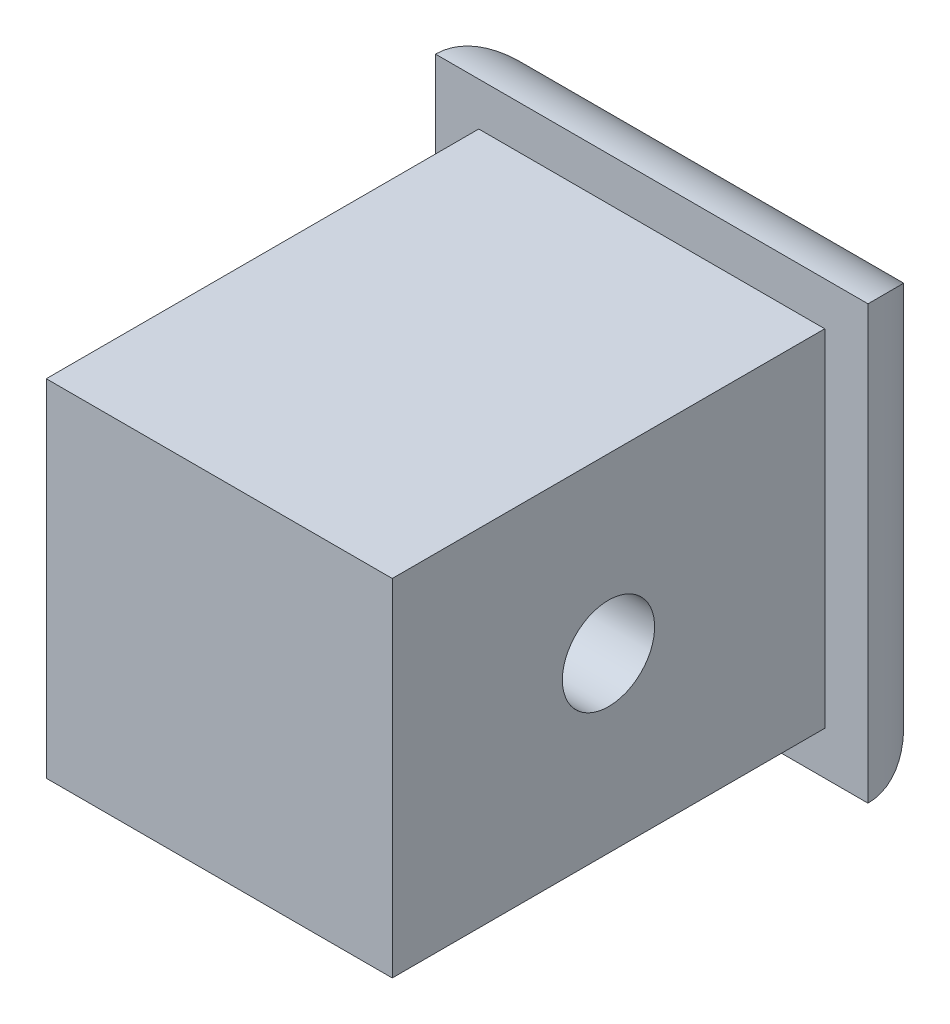
ISO-10303-21;
HEADER;
FILE_DESCRIPTION(('STEP AP214'),'2;1');
FILE_NAME('part.step','',(''),(''),'','','');
FILE_SCHEMA(('AUTOMOTIVE_DESIGN { 1 0 10303 214 1 1 1 1 }'));
ENDSEC;
DATA;
#1=APPLICATION_CONTEXT('core data for automotive mechanical design processes');
#2=APPLICATION_PROTOCOL_DEFINITION('international standard','automotive_design',2000,#1);
#3=PRODUCT_CONTEXT('',#1,'mechanical');
#4=PRODUCT('Part','Part','',(#3));
#5=PRODUCT_RELATED_PRODUCT_CATEGORY('part','',(#4));
#6=PRODUCT_DEFINITION_FORMATION('','',#4);
#7=PRODUCT_DEFINITION_CONTEXT('part definition',#1,'design');
#8=PRODUCT_DEFINITION('design','',#6,#7);
#9=PRODUCT_DEFINITION_SHAPE('','',#8);
#10=(LENGTH_UNIT() NAMED_UNIT(*) SI_UNIT(.MILLI.,.METRE.));
#11=(NAMED_UNIT(*) PLANE_ANGLE_UNIT() SI_UNIT($,.RADIAN.));
#12=(NAMED_UNIT(*) SI_UNIT($,.STERADIAN.) SOLID_ANGLE_UNIT());
#13=UNCERTAINTY_MEASURE_WITH_UNIT(LENGTH_MEASURE(1.E-05),#10,'distance_accuracy_value','');
#14=(GEOMETRIC_REPRESENTATION_CONTEXT(3) GLOBAL_UNCERTAINTY_ASSIGNED_CONTEXT((#13)) GLOBAL_UNIT_ASSIGNED_CONTEXT((#10,
#11,#12)) REPRESENTATION_CONTEXT('',''));
#15=CARTESIAN_POINT('',(0.,0.,0.));
#16=DIRECTION('',(0.,0.,1.));
#17=DIRECTION('',(1.,0.,0.));
#18=AXIS2_PLACEMENT_3D('',#15,#16,#17);
#19=CARTESIAN_POINT('',(0.,0.,3.));
#20=DIRECTION('',(0.,0.,1.));
#21=DIRECTION('',(1.,0.,0.));
#22=AXIS2_PLACEMENT_3D('',#19,#20,#21);
#23=PLANE('',#22);
#24=DIRECTION('',(0.,1.,0.));
#25=VECTOR('',#24,1.);
#26=CARTESIAN_POINT('',(6.,6.,3.));
#27=LINE('',#26,#25);
#28=CARTESIAN_POINT('',(6.,-6.,3.));
#29=VERTEX_POINT('',#28);
#30=CARTESIAN_POINT('',(6.,6.,3.));
#31=VERTEX_POINT('',#30);
#32=EDGE_CURVE('E137',#29,#31,#27,.T.);
#33=ORIENTED_EDGE('',*,*,#32,.F.);
#34=DIRECTION('',(1.,0.,0.));
#35=VECTOR('',#34,1.);
#36=CARTESIAN_POINT('',(-6.,-6.,3.));
#37=LINE('',#36,#35);
#38=CARTESIAN_POINT('',(-6.,-6.,3.));
#39=VERTEX_POINT('',#38);
#40=EDGE_CURVE('E134',#39,#29,#37,.T.);
#41=ORIENTED_EDGE('',*,*,#40,.F.);
#42=DIRECTION('',(0.,-1.,0.));
#43=VECTOR('',#42,1.);
#44=CARTESIAN_POINT('',(-6.,6.,3.));
#45=LINE('',#44,#43);
#46=CARTESIAN_POINT('',(-6.,6.,3.));
#47=VERTEX_POINT('',#46);
#48=EDGE_CURVE('E202',#47,#39,#45,.T.);
#49=ORIENTED_EDGE('',*,*,#48,.F.);
#50=DIRECTION('',(-1.,0.,0.));
#51=VECTOR('',#50,1.);
#52=CARTESIAN_POINT('',(-6.,6.,3.));
#53=LINE('',#52,#51);
#54=EDGE_CURVE('E199',#31,#47,#53,.T.);
#55=ORIENTED_EDGE('',*,*,#54,.F.);
#56=EDGE_LOOP('',(#33,#41,#49,#55));
#57=FACE_BOUND('',#56,.T.);
#58=DIRECTION('',(0.,1.,0.));
#59=VECTOR('',#58,1.);
#60=CARTESIAN_POINT('',(7.5,7.5,3.));
#61=LINE('',#60,#59);
#62=CARTESIAN_POINT('',(7.5,-7.5,3.));
#63=VERTEX_POINT('',#62);
#64=CARTESIAN_POINT('',(7.5,7.5,3.));
#65=VERTEX_POINT('',#64);
#66=EDGE_CURVE('E139',#63,#65,#61,.T.);
#67=ORIENTED_EDGE('',*,*,#66,.T.);
#68=DIRECTION('',(-1.,0.,0.));
#69=VECTOR('',#68,1.);
#70=CARTESIAN_POINT('',(-7.5,7.5,3.));
#71=LINE('',#70,#69);
#72=CARTESIAN_POINT('',(-7.5,7.5,3.));
#73=VERTEX_POINT('',#72);
#74=EDGE_CURVE('E143',#65,#73,#71,.T.);
#75=ORIENTED_EDGE('',*,*,#74,.T.);
#76=DIRECTION('',(0.,-1.,0.));
#77=VECTOR('',#76,1.);
#78=CARTESIAN_POINT('',(-7.5,7.5,3.));
#79=LINE('',#78,#77);
#80=CARTESIAN_POINT('',(-7.5,-7.5,3.));
#81=VERTEX_POINT('',#80);
#82=EDGE_CURVE('E152',#73,#81,#79,.T.);
#83=ORIENTED_EDGE('',*,*,#82,.T.);
#84=DIRECTION('',(1.,0.,0.));
#85=VECTOR('',#84,1.);
#86=CARTESIAN_POINT('',(-7.5,-7.5,3.));
#87=LINE('',#86,#85);
#88=EDGE_CURVE('E155',#81,#63,#87,.T.);
#89=ORIENTED_EDGE('',*,*,#88,.T.);
#90=EDGE_LOOP('',(#67,#75,#83,#89));
#91=FACE_BOUND('',#90,.T.);
#92=ADVANCED_FACE('F45',(#57,#91),#23,.T.);
#93=CARTESIAN_POINT('',(0.,0.,0.));
#94=DIRECTION('',(0.,0.,1.));
#95=DIRECTION('',(1.,0.,0.));
#96=AXIS2_PLACEMENT_3D('',#93,#94,#95);
#97=PLANE('',#96);
#98=DIRECTION('',(0.,-1.,0.));
#99=VECTOR('',#98,1.);
#100=CARTESIAN_POINT('',(-4.5,0.,0.));
#101=LINE('',#100,#99);
#102=CARTESIAN_POINT('',(-4.5,-4.5,0.));
#103=VERTEX_POINT('',#102);
#104=CARTESIAN_POINT('',(-4.5,4.5,0.));
#105=VERTEX_POINT('',#104);
#106=EDGE_CURVE('E55',#103,#105,#101,.F.);
#107=ORIENTED_EDGE('',*,*,#106,.T.);
#108=DIRECTION('',(-1.,0.,0.));
#109=VECTOR('',#108,1.);
#110=CARTESIAN_POINT('',(0.,4.5,0.));
#111=LINE('',#110,#109);
#112=CARTESIAN_POINT('',(4.5,4.5,0.));
#113=VERTEX_POINT('',#112);
#114=EDGE_CURVE('E11',#105,#113,#111,.F.);
#115=ORIENTED_EDGE('',*,*,#114,.T.);
#116=DIRECTION('',(0.,1.,0.));
#117=VECTOR('',#116,1.);
#118=CARTESIAN_POINT('',(4.5,0.,0.));
#119=LINE('',#118,#117);
#120=CARTESIAN_POINT('',(4.5,-4.5,0.));
#121=VERTEX_POINT('',#120);
#122=EDGE_CURVE('E158',#113,#121,#119,.F.);
#123=ORIENTED_EDGE('',*,*,#122,.T.);
#124=DIRECTION('',(1.,0.,0.));
#125=VECTOR('',#124,1.);
#126=CARTESIAN_POINT('',(0.,-4.5,0.));
#127=LINE('',#126,#125);
#128=EDGE_CURVE('E66',#121,#103,#127,.F.);
#129=ORIENTED_EDGE('',*,*,#128,.T.);
#130=EDGE_LOOP('',(#107,#115,#123,#129));
#131=FACE_BOUND('',#130,.T.);
#132=ADVANCED_FACE('F220',(#131),#97,.F.);
#133=CARTESIAN_POINT('',(6.,6.,18.));
#134=DIRECTION('',(-1.,0.,0.));
#135=DIRECTION('',(0.,0.,1.));
#136=AXIS2_PLACEMENT_3D('',#133,#134,#135);
#137=PLANE('',#136);
#138=CARTESIAN_POINT('',(6.,0.,10.5));
#139=DIRECTION('',(-1.,0.,0.));
#140=DIRECTION('',(0.,0.,1.));
#141=AXIS2_PLACEMENT_3D('',#138,#139,#140);
#142=CIRCLE('',#141,1.6);
#143=CARTESIAN_POINT('',(6.,0.,12.1));
#144=VERTEX_POINT('',#143);
#145=EDGE_CURVE('E184',#144,#144,#142,.T.);
#146=ORIENTED_EDGE('',*,*,#145,.T.);
#147=EDGE_LOOP('',(#146));
#148=FACE_BOUND('',#147,.T.);
#149=ORIENTED_EDGE('',*,*,#32,.T.);
#150=DIRECTION('',(0.,0.,-1.));
#151=VECTOR('',#150,1.);
#152=CARTESIAN_POINT('',(6.,6.,18.));
#153=LINE('',#152,#151);
#154=CARTESIAN_POINT('',(6.,6.,18.));
#155=VERTEX_POINT('',#154);
#156=EDGE_CURVE('E116',#155,#31,#153,.T.);
#157=ORIENTED_EDGE('',*,*,#156,.F.);
#158=DIRECTION('',(0.,1.,0.));
#159=VECTOR('',#158,1.);
#160=CARTESIAN_POINT('',(6.,6.,18.));
#161=LINE('',#160,#159);
#162=CARTESIAN_POINT('',(6.,-6.,18.));
#163=VERTEX_POINT('',#162);
#164=EDGE_CURVE('E124',#163,#155,#161,.T.);
#165=ORIENTED_EDGE('',*,*,#164,.F.);
#166=DIRECTION('',(0.,0.,-1.));
#167=VECTOR('',#166,1.);
#168=CARTESIAN_POINT('',(6.,-6.,18.));
#169=LINE('',#168,#167);
#170=EDGE_CURVE('E196',#163,#29,#169,.T.);
#171=ORIENTED_EDGE('',*,*,#170,.T.);
#172=EDGE_LOOP('',(#149,#157,#165,#171));
#173=FACE_BOUND('',#172,.T.);
#174=ADVANCED_FACE('F136',(#148,#173),#137,.F.);
#175=CARTESIAN_POINT('',(-6.,6.,18.));
#176=DIRECTION('',(0.,-1.,0.));
#177=DIRECTION('',(0.,0.,-1.));
#178=AXIS2_PLACEMENT_3D('',#175,#176,#177);
#179=PLANE('',#178);
#180=ORIENTED_EDGE('',*,*,#54,.T.);
#181=DIRECTION('',(0.,0.,-1.));
#182=VECTOR('',#181,1.);
#183=CARTESIAN_POINT('',(-6.,6.,18.));
#184=LINE('',#183,#182);
#185=CARTESIAN_POINT('',(-6.,6.,18.));
#186=VERTEX_POINT('',#185);
#187=EDGE_CURVE('E119',#186,#47,#184,.T.);
#188=ORIENTED_EDGE('',*,*,#187,.F.);
#189=DIRECTION('',(-1.,0.,0.));
#190=VECTOR('',#189,1.);
#191=CARTESIAN_POINT('',(-6.,6.,18.));
#192=LINE('',#191,#190);
#193=EDGE_CURVE('E111',#155,#186,#192,.T.);
#194=ORIENTED_EDGE('',*,*,#193,.F.);
#195=ORIENTED_EDGE('',*,*,#156,.T.);
#196=EDGE_LOOP('',(#180,#188,#194,#195));
#197=FACE_BOUND('',#196,.T.);
#198=ADVANCED_FACE('F114',(#197),#179,.F.);
#199=CARTESIAN_POINT('',(-6.,6.,18.));
#200=DIRECTION('',(1.,0.,0.));
#201=DIRECTION('',(0.,0.,-1.));
#202=AXIS2_PLACEMENT_3D('',#199,#200,#201);
#203=PLANE('',#202);
#204=CARTESIAN_POINT('',(-6.,0.,10.5));
#205=DIRECTION('',(-1.,0.,0.));
#206=DIRECTION('',(0.,0.,1.));
#207=AXIS2_PLACEMENT_3D('',#204,#205,#206);
#208=CIRCLE('',#207,1.6);
#209=CARTESIAN_POINT('',(-6.,0.,12.1));
#210=VERTEX_POINT('',#209);
#211=EDGE_CURVE('E177',#210,#210,#208,.T.);
#212=ORIENTED_EDGE('',*,*,#211,.F.);
#213=EDGE_LOOP('',(#212));
#214=FACE_BOUND('',#213,.T.);
#215=ORIENTED_EDGE('',*,*,#48,.T.);
#216=DIRECTION('',(0.,0.,-1.));
#217=VECTOR('',#216,1.);
#218=CARTESIAN_POINT('',(-6.,-6.,18.));
#219=LINE('',#218,#217);
#220=CARTESIAN_POINT('',(-6.,-6.,18.));
#221=VERTEX_POINT('',#220);
#222=EDGE_CURVE('E145',#221,#39,#219,.T.);
#223=ORIENTED_EDGE('',*,*,#222,.F.);
#224=DIRECTION('',(0.,-1.,0.));
#225=VECTOR('',#224,1.);
#226=CARTESIAN_POINT('',(-6.,6.,18.));
#227=LINE('',#226,#225);
#228=EDGE_CURVE('E123',#186,#221,#227,.T.);
#229=ORIENTED_EDGE('',*,*,#228,.F.);
#230=ORIENTED_EDGE('',*,*,#187,.T.);
#231=EDGE_LOOP('',(#215,#223,#229,#230));
#232=FACE_BOUND('',#231,.T.);
#233=ADVANCED_FACE('F216',(#214,#232),#203,.F.);
#234=CARTESIAN_POINT('',(-6.,-6.,18.));
#235=DIRECTION('',(0.,1.,0.));
#236=DIRECTION('',(0.,0.,1.));
#237=AXIS2_PLACEMENT_3D('',#234,#235,#236);
#238=PLANE('',#237);
#239=ORIENTED_EDGE('',*,*,#40,.T.);
#240=ORIENTED_EDGE('',*,*,#170,.F.);
#241=DIRECTION('',(1.,0.,0.));
#242=VECTOR('',#241,1.);
#243=CARTESIAN_POINT('',(-6.,-6.,18.));
#244=LINE('',#243,#242);
#245=EDGE_CURVE('E129',#221,#163,#244,.T.);
#246=ORIENTED_EDGE('',*,*,#245,.F.);
#247=ORIENTED_EDGE('',*,*,#222,.T.);
#248=EDGE_LOOP('',(#239,#240,#246,#247));
#249=FACE_BOUND('',#248,.T.);
#250=ADVANCED_FACE('F214',(#249),#238,.F.);
#251=CARTESIAN_POINT('',(0.,0.,18.));
#252=DIRECTION('',(0.,0.,1.));
#253=DIRECTION('',(1.,0.,0.));
#254=AXIS2_PLACEMENT_3D('',#251,#252,#253);
#255=PLANE('',#254);
#256=ORIENTED_EDGE('',*,*,#164,.T.);
#257=ORIENTED_EDGE('',*,*,#193,.T.);
#258=ORIENTED_EDGE('',*,*,#228,.T.);
#259=ORIENTED_EDGE('',*,*,#245,.T.);
#260=EDGE_LOOP('',(#256,#257,#258,#259));
#261=FACE_BOUND('',#260,.T.);
#262=ADVANCED_FACE('F127',(#261),#255,.T.);
#263=CARTESIAN_POINT('',(7.5,0.,10.5));
#264=DIRECTION('',(-1.,0.,0.));
#265=DIRECTION('',(0.,0.,1.));
#266=AXIS2_PLACEMENT_3D('',#263,#264,#265);
#267=CYLINDRICAL_SURFACE('',#266,1.6);
#268=ORIENTED_EDGE('',*,*,#211,.T.);
#269=EDGE_LOOP('',(#268));
#270=FACE_BOUND('',#269,.T.);
#271=ORIENTED_EDGE('',*,*,#145,.F.);
#272=EDGE_LOOP('',(#271));
#273=FACE_BOUND('',#272,.T.);
#274=ADVANCED_FACE('F232',(#270,#273),#267,.F.);
#275=CARTESIAN_POINT('',(-7.5,-4.5,3.));
#276=DIRECTION('',(1.,0.,0.));
#277=DIRECTION('',(0.,0.,-1.));
#278=AXIS2_PLACEMENT_3D('',#275,#276,#277);
#279=CYLINDRICAL_SURFACE('',#278,3.);
#280=CARTESIAN_POINT('',(-4.5,-4.5,3.));
#281=DIRECTION('',(0.707106781186548,-0.707106781186547,0.));
#282=DIRECTION('',(0.707106781186547,0.707106781186548,0.));
#283=AXIS2_PLACEMENT_3D('',#280,#281,#282);
#284=ELLIPSE('',#283,4.24264068711928,3.);
#285=EDGE_CURVE('E170',#103,#81,#284,.F.);
#286=ORIENTED_EDGE('',*,*,#285,.F.);
#287=ORIENTED_EDGE('',*,*,#128,.F.);
#288=CARTESIAN_POINT('',(4.5,-4.5,3.));
#289=DIRECTION('',(0.707106781186547,0.707106781186548,0.));
#290=DIRECTION('',(-0.707106781186548,0.707106781186547,0.));
#291=AXIS2_PLACEMENT_3D('',#288,#289,#290);
#292=ELLIPSE('',#291,4.24264068711929,3.);
#293=EDGE_CURVE('E49',#63,#121,#292,.T.);
#294=ORIENTED_EDGE('',*,*,#293,.F.);
#295=ORIENTED_EDGE('',*,*,#88,.F.);
#296=EDGE_LOOP('',(#286,#287,#294,#295));
#297=FACE_BOUND('',#296,.T.);
#298=ADVANCED_FACE('F47',(#297),#279,.T.);
#299=CARTESIAN_POINT('',(4.5,7.5,3.));
#300=DIRECTION('',(0.,1.,0.));
#301=DIRECTION('',(-1.,0.,0.));
#302=AXIS2_PLACEMENT_3D('',#299,#300,#301);
#303=CYLINDRICAL_SURFACE('',#302,3.);
#304=ORIENTED_EDGE('',*,*,#293,.T.);
#305=ORIENTED_EDGE('',*,*,#122,.F.);
#306=CARTESIAN_POINT('',(4.5,4.5,3.));
#307=DIRECTION('',(-0.707106781186548,0.707106781186547,0.));
#308=DIRECTION('',(0.707106781186547,0.707106781186548,0.));
#309=AXIS2_PLACEMENT_3D('',#306,#307,#308);
#310=ELLIPSE('',#309,4.24264068711928,3.);
#311=EDGE_CURVE('E168',#65,#113,#310,.T.);
#312=ORIENTED_EDGE('',*,*,#311,.F.);
#313=ORIENTED_EDGE('',*,*,#66,.F.);
#314=EDGE_LOOP('',(#304,#305,#312,#313));
#315=FACE_BOUND('',#314,.T.);
#316=ADVANCED_FACE('F225',(#315),#303,.T.);
#317=CARTESIAN_POINT('',(-4.5,7.5,3.));
#318=DIRECTION('',(0.,-1.,0.));
#319=DIRECTION('',(1.,0.,0.));
#320=AXIS2_PLACEMENT_3D('',#317,#318,#319);
#321=CYLINDRICAL_SURFACE('',#320,3.);
#322=ORIENTED_EDGE('',*,*,#285,.T.);
#323=ORIENTED_EDGE('',*,*,#82,.F.);
#324=CARTESIAN_POINT('',(-4.5,4.5,3.));
#325=DIRECTION('',(-0.707106781186547,-0.707106781186548,0.));
#326=DIRECTION('',(0.707106781186548,-0.707106781186547,0.));
#327=AXIS2_PLACEMENT_3D('',#324,#325,#326);
#328=ELLIPSE('',#327,4.24264068711929,3.);
#329=EDGE_CURVE('E165',#105,#73,#328,.F.);
#330=ORIENTED_EDGE('',*,*,#329,.F.);
#331=ORIENTED_EDGE('',*,*,#106,.F.);
#332=EDGE_LOOP('',(#322,#323,#330,#331));
#333=FACE_BOUND('',#332,.T.);
#334=ADVANCED_FACE('F229',(#333),#321,.T.);
#335=CARTESIAN_POINT('',(-7.5,4.5,3.));
#336=DIRECTION('',(-1.,0.,0.));
#337=DIRECTION('',(0.,0.,1.));
#338=AXIS2_PLACEMENT_3D('',#335,#336,#337);
#339=CYLINDRICAL_SURFACE('',#338,3.);
#340=ORIENTED_EDGE('',*,*,#311,.T.);
#341=ORIENTED_EDGE('',*,*,#114,.F.);
#342=ORIENTED_EDGE('',*,*,#329,.T.);
#343=ORIENTED_EDGE('',*,*,#74,.F.);
#344=EDGE_LOOP('',(#340,#341,#342,#343));
#345=FACE_BOUND('',#344,.T.);
#346=ADVANCED_FACE('F227',(#345),#339,.T.);
#347=CLOSED_SHELL('',(#92,#132,#174,#198,#233,#250,#262,#274,#298,#316,#334,#346));
#348=MANIFOLD_SOLID_BREP('B2',#347);
#349=ADVANCED_BREP_SHAPE_REPRESENTATION('',(#18,#348),#14);
#350=SHAPE_DEFINITION_REPRESENTATION(#9,#349);
ENDSEC;
END-ISO-10303-21;
